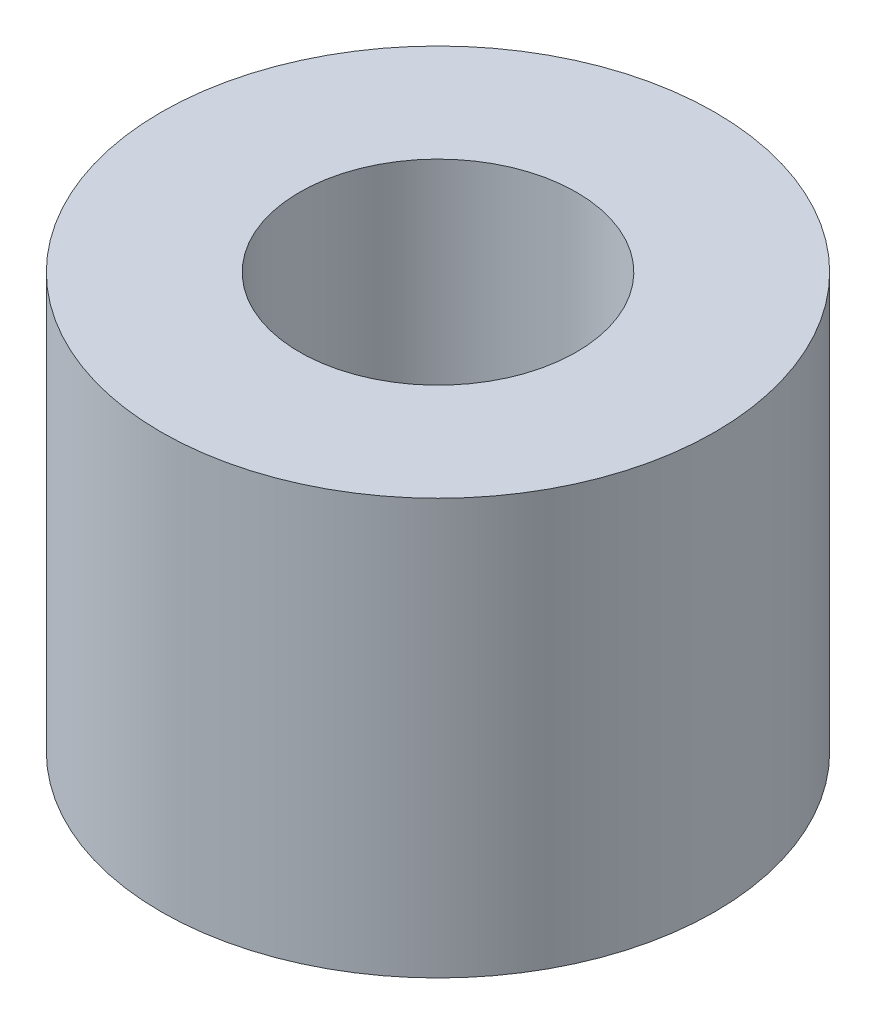
ISO-10303-21;
HEADER;
FILE_DESCRIPTION(('STEP AP214'),'2;1');
FILE_NAME('part.step','',(''),(''),'','','');
FILE_SCHEMA(('AUTOMOTIVE_DESIGN { 1 0 10303 214 1 1 1 1 }'));
ENDSEC;
DATA;
#1=APPLICATION_CONTEXT('core data for automotive mechanical design processes');
#2=APPLICATION_PROTOCOL_DEFINITION('international standard','automotive_design',2000,#1);
#3=PRODUCT_CONTEXT('',#1,'mechanical');
#4=PRODUCT('Part','Part','',(#3));
#5=PRODUCT_RELATED_PRODUCT_CATEGORY('part','',(#4));
#6=PRODUCT_DEFINITION_FORMATION('','',#4);
#7=PRODUCT_DEFINITION_CONTEXT('part definition',#1,'design');
#8=PRODUCT_DEFINITION('design','',#6,#7);
#9=PRODUCT_DEFINITION_SHAPE('','',#8);
#10=(LENGTH_UNIT() NAMED_UNIT(*) SI_UNIT(.MILLI.,.METRE.));
#11=(NAMED_UNIT(*) PLANE_ANGLE_UNIT() SI_UNIT($,.RADIAN.));
#12=(NAMED_UNIT(*) SI_UNIT($,.STERADIAN.) SOLID_ANGLE_UNIT());
#13=UNCERTAINTY_MEASURE_WITH_UNIT(LENGTH_MEASURE(1.E-05),#10,'distance_accuracy_value','');
#14=(GEOMETRIC_REPRESENTATION_CONTEXT(3) GLOBAL_UNCERTAINTY_ASSIGNED_CONTEXT((#13)) GLOBAL_UNIT_ASSIGNED_CONTEXT((#10,
#11,#12)) REPRESENTATION_CONTEXT('',''));
#15=CARTESIAN_POINT('',(0.,0.,0.));
#16=DIRECTION('',(0.,0.,1.));
#17=DIRECTION('',(1.,0.,0.));
#18=AXIS2_PLACEMENT_3D('',#15,#16,#17);
#19=CARTESIAN_POINT('',(0.,9.525,0.));
#20=DIRECTION('',(0.,1.,0.));
#21=DIRECTION('',(0.,0.,1.));
#22=AXIS2_PLACEMENT_3D('',#19,#20,#21);
#23=PLANE('',#22);
#24=CARTESIAN_POINT('',(0.,9.525,0.));
#25=DIRECTION('',(0.,1.,0.));
#26=DIRECTION('',(0.,0.,1.));
#27=AXIS2_PLACEMENT_3D('',#24,#25,#26);
#28=CIRCLE('',#27,6.35);
#29=CARTESIAN_POINT('',(0.,9.525,-6.35));
#30=VERTEX_POINT('',#29);
#31=EDGE_CURVE('E10',#30,#30,#28,.T.);
#32=ORIENTED_EDGE('',*,*,#31,.T.);
#33=EDGE_LOOP('',(#32));
#34=FACE_BOUND('',#33,.T.);
#35=CARTESIAN_POINT('',(0.,9.525,0.));
#36=DIRECTION('',(0.,1.,0.));
#37=DIRECTION('',(0.,0.,1.));
#38=AXIS2_PLACEMENT_3D('',#35,#36,#37);
#39=CIRCLE('',#38,3.175);
#40=CARTESIAN_POINT('',(0.,9.525,-3.175));
#41=VERTEX_POINT('',#40);
#42=EDGE_CURVE('E54',#41,#41,#39,.T.);
#43=ORIENTED_EDGE('',*,*,#42,.F.);
#44=EDGE_LOOP('',(#43));
#45=FACE_BOUND('',#44,.T.);
#46=ADVANCED_FACE('F41',(#34,#45),#23,.T.);
#47=CARTESIAN_POINT('',(0.,0.,0.));
#48=DIRECTION('',(0.,1.,0.));
#49=DIRECTION('',(0.,0.,1.));
#50=AXIS2_PLACEMENT_3D('',#47,#48,#49);
#51=PLANE('',#50);
#52=CARTESIAN_POINT('',(0.,0.,0.));
#53=DIRECTION('',(0.,1.,0.));
#54=DIRECTION('',(0.,0.,1.));
#55=AXIS2_PLACEMENT_3D('',#52,#53,#54);
#56=CIRCLE('',#55,6.35);
#57=CARTESIAN_POINT('',(0.,0.,-6.35));
#58=VERTEX_POINT('',#57);
#59=EDGE_CURVE('E45',#58,#58,#56,.T.);
#60=ORIENTED_EDGE('',*,*,#59,.F.);
#61=EDGE_LOOP('',(#60));
#62=FACE_BOUND('',#61,.T.);
#63=CARTESIAN_POINT('',(0.,0.,0.));
#64=DIRECTION('',(0.,1.,0.));
#65=DIRECTION('',(0.,0.,1.));
#66=AXIS2_PLACEMENT_3D('',#63,#64,#65);
#67=CIRCLE('',#66,3.175);
#68=CARTESIAN_POINT('',(0.,0.,-3.175));
#69=VERTEX_POINT('',#68);
#70=EDGE_CURVE('E56',#69,#69,#67,.T.);
#71=ORIENTED_EDGE('',*,*,#70,.T.);
#72=EDGE_LOOP('',(#71));
#73=FACE_BOUND('',#72,.T.);
#74=ADVANCED_FACE('F68',(#62,#73),#51,.F.);
#75=CARTESIAN_POINT('',(0.,9.525,0.));
#76=DIRECTION('',(0.,-1.,0.));
#77=DIRECTION('',(0.,0.,-1.));
#78=AXIS2_PLACEMENT_3D('',#75,#76,#77);
#79=CYLINDRICAL_SURFACE('',#78,6.35);
#80=CARTESIAN_POINT('',(0.,9.525,-6.35));
#81=CARTESIAN_POINT('',(0.,9.42578125,-6.35));
#82=CARTESIAN_POINT('',(0.,9.3265625,-6.35));
#83=CARTESIAN_POINT('',(0.,9.128125,-6.35));
#84=CARTESIAN_POINT('',(0.,9.02890625,-6.35));
#85=CARTESIAN_POINT('',(0.,8.83046875,-6.35));
#86=CARTESIAN_POINT('',(0.,8.73125,-6.35));
#87=CARTESIAN_POINT('',(0.,8.5328125,-6.35));
#88=CARTESIAN_POINT('',(0.,8.43359375,-6.35));
#89=CARTESIAN_POINT('',(0.,8.23515625,-6.35));
#90=CARTESIAN_POINT('',(0.,8.1359375,-6.35));
#91=CARTESIAN_POINT('',(0.,7.9375,-6.35));
#92=CARTESIAN_POINT('',(0.,7.83828125,-6.35));
#93=CARTESIAN_POINT('',(0.,7.63984375,-6.35));
#94=CARTESIAN_POINT('',(0.,7.540625,-6.35));
#95=CARTESIAN_POINT('',(0.,7.3421875,-6.35));
#96=CARTESIAN_POINT('',(0.,7.24296875,-6.35));
#97=CARTESIAN_POINT('',(0.,7.04453125,-6.35));
#98=CARTESIAN_POINT('',(0.,6.9453125,-6.35));
#99=CARTESIAN_POINT('',(0.,6.746875,-6.35));
#100=CARTESIAN_POINT('',(0.,6.64765625,-6.35));
#101=CARTESIAN_POINT('',(0.,6.44921875,-6.35));
#102=CARTESIAN_POINT('',(0.,6.35,-6.35));
#103=CARTESIAN_POINT('',(0.,6.1515625,-6.35));
#104=CARTESIAN_POINT('',(0.,6.05234375,-6.35));
#105=CARTESIAN_POINT('',(0.,5.85390625,-6.35));
#106=CARTESIAN_POINT('',(0.,5.7546875,-6.35));
#107=CARTESIAN_POINT('',(0.,5.55625,-6.35));
#108=CARTESIAN_POINT('',(0.,5.45703125,-6.35));
#109=CARTESIAN_POINT('',(0.,5.25859375,-6.35));
#110=CARTESIAN_POINT('',(0.,5.159375,-6.35));
#111=CARTESIAN_POINT('',(0.,4.9609375,-6.35));
#112=CARTESIAN_POINT('',(0.,4.86171875,-6.35));
#113=CARTESIAN_POINT('',(0.,4.66328125,-6.35));
#114=CARTESIAN_POINT('',(0.,4.5640625,-6.35));
#115=CARTESIAN_POINT('',(0.,4.365625,-6.35));
#116=CARTESIAN_POINT('',(0.,4.26640625,-6.35));
#117=CARTESIAN_POINT('',(0.,4.06796875,-6.35));
#118=CARTESIAN_POINT('',(0.,3.96875,-6.35));
#119=CARTESIAN_POINT('',(0.,3.7703125,-6.35));
#120=CARTESIAN_POINT('',(0.,3.67109375,-6.35));
#121=CARTESIAN_POINT('',(0.,3.47265625,-6.35));
#122=CARTESIAN_POINT('',(0.,3.3734375,-6.35));
#123=CARTESIAN_POINT('',(0.,3.175,-6.35));
#124=CARTESIAN_POINT('',(0.,3.07578125,-6.35));
#125=CARTESIAN_POINT('',(0.,2.87734375,-6.35));
#126=CARTESIAN_POINT('',(0.,2.778125,-6.35));
#127=CARTESIAN_POINT('',(0.,2.5796875,-6.35));
#128=CARTESIAN_POINT('',(0.,2.48046875,-6.35));
#129=CARTESIAN_POINT('',(0.,2.28203125,-6.35));
#130=CARTESIAN_POINT('',(0.,2.1828125,-6.35));
#131=CARTESIAN_POINT('',(0.,1.984375,-6.35));
#132=CARTESIAN_POINT('',(0.,1.88515625,-6.35));
#133=CARTESIAN_POINT('',(0.,1.68671875,-6.35));
#134=CARTESIAN_POINT('',(0.,1.5875,-6.35));
#135=CARTESIAN_POINT('',(0.,1.3890625,-6.35));
#136=CARTESIAN_POINT('',(0.,1.28984375,-6.35));
#137=CARTESIAN_POINT('',(0.,1.09140625,-6.35));
#138=CARTESIAN_POINT('',(0.,0.992187500000001,-6.35));
#139=CARTESIAN_POINT('',(0.,0.793750000000001,-6.35));
#140=CARTESIAN_POINT('',(0.,0.69453125,-6.35));
#141=CARTESIAN_POINT('',(0.,0.49609375,-6.35));
#142=CARTESIAN_POINT('',(0.,0.396875,-6.35));
#143=CARTESIAN_POINT('',(0.,0.1984375,-6.35));
#144=CARTESIAN_POINT('',(0.,0.0992187500000001,-6.35));
#145=CARTESIAN_POINT('',(0.,0.,-6.35));
#146=B_SPLINE_CURVE_WITH_KNOTS('',3,(#80,#81,#82,#83,#84,#85,#86,#87,#88,#89,#90,#91,#92,#93,
#94,#95,#96,#97,#98,#99,#100,#101,#102,#103,#104,#105,#106,#107,#108,#109,#110,#111,#112,#113,
#114,#115,#116,#117,#118,#119,#120,#121,#122,#123,#124,#125,#126,#127,#128,#129,#130,#131,#132,
#133,#134,#135,#136,#137,#138,#139,#140,#141,#142,#143,#144,#145),.UNSPECIFIED.,.F.,.F.,(4,2,2,
2,2,2,2,2,2,2,2,2,2,2,2,2,2,2,2,2,2,2,2,2,2,2,2,2,2,2,2,2,4),(0.,0.297656249999998,
0.595312499999999,0.892968749999999,1.190625,1.48828125,1.7859375,2.08359375,2.38125,2.67890625,
2.9765625,3.27421875,3.571875,3.86953125,4.1671875,4.46484375,4.7625,5.06015625,5.3578125,
5.65546875,5.953125,6.25078125,6.5484375,6.84609375,7.14375,7.44140625,7.7390625,8.03671875,
8.334375,8.63203125,8.9296875,9.22734375,9.525),.UNSPECIFIED.);
#147=EDGE_CURVE('BSEAM43',#30,#58,#146,.T.);
#148=ORIENTED_EDGE('',*,*,#31,.F.);
#149=ORIENTED_EDGE('',*,*,#59,.T.);
#150=ORIENTED_EDGE('',*,*,#147,.T.);
#151=ORIENTED_EDGE('',*,*,#147,.F.);
#152=EDGE_LOOP('',(#148,#150,#149,#151));
#153=FACE_BOUND('',#152,.T.);
#154=ADVANCED_FACE('F43',(#153),#79,.T.);
#155=CARTESIAN_POINT('',(0.,9.525,0.));
#156=DIRECTION('',(0.,-1.,0.));
#157=DIRECTION('',(0.,0.,-1.));
#158=AXIS2_PLACEMENT_3D('',#155,#156,#157);
#159=CYLINDRICAL_SURFACE('',#158,3.175);
#160=CARTESIAN_POINT('',(0.,9.525,-3.175));
#161=CARTESIAN_POINT('',(0.,9.42578125,-3.175));
#162=CARTESIAN_POINT('',(0.,9.3265625,-3.175));
#163=CARTESIAN_POINT('',(0.,9.128125,-3.175));
#164=CARTESIAN_POINT('',(0.,9.02890625,-3.175));
#165=CARTESIAN_POINT('',(0.,8.83046875,-3.175));
#166=CARTESIAN_POINT('',(0.,8.73125,-3.175));
#167=CARTESIAN_POINT('',(0.,8.5328125,-3.175));
#168=CARTESIAN_POINT('',(0.,8.43359375,-3.175));
#169=CARTESIAN_POINT('',(0.,8.23515625,-3.175));
#170=CARTESIAN_POINT('',(0.,8.1359375,-3.175));
#171=CARTESIAN_POINT('',(0.,7.9375,-3.175));
#172=CARTESIAN_POINT('',(0.,7.83828125,-3.175));
#173=CARTESIAN_POINT('',(0.,7.63984375,-3.175));
#174=CARTESIAN_POINT('',(0.,7.540625,-3.175));
#175=CARTESIAN_POINT('',(0.,7.3421875,-3.175));
#176=CARTESIAN_POINT('',(0.,7.24296875,-3.175));
#177=CARTESIAN_POINT('',(0.,7.04453125,-3.175));
#178=CARTESIAN_POINT('',(0.,6.9453125,-3.175));
#179=CARTESIAN_POINT('',(0.,6.746875,-3.175));
#180=CARTESIAN_POINT('',(0.,6.64765625,-3.175));
#181=CARTESIAN_POINT('',(0.,6.44921875,-3.175));
#182=CARTESIAN_POINT('',(0.,6.35,-3.175));
#183=CARTESIAN_POINT('',(0.,6.1515625,-3.175));
#184=CARTESIAN_POINT('',(0.,6.05234375,-3.175));
#185=CARTESIAN_POINT('',(0.,5.85390625,-3.175));
#186=CARTESIAN_POINT('',(0.,5.7546875,-3.175));
#187=CARTESIAN_POINT('',(0.,5.55625,-3.175));
#188=CARTESIAN_POINT('',(0.,5.45703125,-3.175));
#189=CARTESIAN_POINT('',(0.,5.25859375,-3.175));
#190=CARTESIAN_POINT('',(0.,5.159375,-3.175));
#191=CARTESIAN_POINT('',(0.,4.9609375,-3.175));
#192=CARTESIAN_POINT('',(0.,4.86171875,-3.175));
#193=CARTESIAN_POINT('',(0.,4.66328125,-3.175));
#194=CARTESIAN_POINT('',(0.,4.5640625,-3.175));
#195=CARTESIAN_POINT('',(0.,4.365625,-3.175));
#196=CARTESIAN_POINT('',(0.,4.26640625,-3.175));
#197=CARTESIAN_POINT('',(0.,4.06796875,-3.175));
#198=CARTESIAN_POINT('',(0.,3.96875,-3.175));
#199=CARTESIAN_POINT('',(0.,3.7703125,-3.175));
#200=CARTESIAN_POINT('',(0.,3.67109375,-3.175));
#201=CARTESIAN_POINT('',(0.,3.47265625,-3.175));
#202=CARTESIAN_POINT('',(0.,3.3734375,-3.175));
#203=CARTESIAN_POINT('',(0.,3.175,-3.175));
#204=CARTESIAN_POINT('',(0.,3.07578125,-3.175));
#205=CARTESIAN_POINT('',(0.,2.87734375,-3.175));
#206=CARTESIAN_POINT('',(0.,2.778125,-3.175));
#207=CARTESIAN_POINT('',(0.,2.5796875,-3.175));
#208=CARTESIAN_POINT('',(0.,2.48046875,-3.175));
#209=CARTESIAN_POINT('',(0.,2.28203125,-3.175));
#210=CARTESIAN_POINT('',(0.,2.1828125,-3.175));
#211=CARTESIAN_POINT('',(0.,1.984375,-3.175));
#212=CARTESIAN_POINT('',(0.,1.88515625,-3.175));
#213=CARTESIAN_POINT('',(0.,1.68671875,-3.175));
#214=CARTESIAN_POINT('',(0.,1.5875,-3.175));
#215=CARTESIAN_POINT('',(0.,1.3890625,-3.175));
#216=CARTESIAN_POINT('',(0.,1.28984375,-3.175));
#217=CARTESIAN_POINT('',(0.,1.09140625,-3.175));
#218=CARTESIAN_POINT('',(0.,0.992187500000001,-3.175));
#219=CARTESIAN_POINT('',(0.,0.793750000000001,-3.175));
#220=CARTESIAN_POINT('',(0.,0.69453125,-3.175));
#221=CARTESIAN_POINT('',(0.,0.49609375,-3.175));
#222=CARTESIAN_POINT('',(0.,0.396875,-3.175));
#223=CARTESIAN_POINT('',(0.,0.1984375,-3.175));
#224=CARTESIAN_POINT('',(0.,0.0992187500000001,-3.175));
#225=CARTESIAN_POINT('',(0.,0.,-3.175));
#226=B_SPLINE_CURVE_WITH_KNOTS('',3,(#160,#161,#162,#163,#164,#165,#166,#167,#168,#169,#170,
#171,#172,#173,#174,#175,#176,#177,#178,#179,#180,#181,#182,#183,#184,#185,#186,#187,#188,#189,
#190,#191,#192,#193,#194,#195,#196,#197,#198,#199,#200,#201,#202,#203,#204,#205,#206,#207,#208,
#209,#210,#211,#212,#213,#214,#215,#216,#217,#218,#219,#220,#221,#222,#223,#224,#225),
.UNSPECIFIED.,.F.,.F.,(4,2,2,2,2,2,2,2,2,2,2,2,2,2,2,2,2,2,2,2,2,2,2,2,2,2,2,2,2,2,2,2,4),(0.,
0.29765625,0.5953125,0.892968750000001,1.190625,1.48828125,1.7859375,2.08359375,2.38125,
2.67890625,2.9765625,3.27421875,3.571875,3.86953125,4.1671875,4.46484375,4.7625,5.06015625,
5.3578125,5.65546875,5.953125,6.25078125,6.5484375,6.84609375,7.14375,7.44140625,7.7390625,
8.03671875,8.334375,8.63203125,8.9296875,9.22734375,9.525),.UNSPECIFIED.);
#227=EDGE_CURVE('BSEAM64',#41,#69,#226,.T.);
#228=ORIENTED_EDGE('',*,*,#42,.T.);
#229=ORIENTED_EDGE('',*,*,#70,.F.);
#230=ORIENTED_EDGE('',*,*,#227,.T.);
#231=ORIENTED_EDGE('',*,*,#227,.F.);
#232=EDGE_LOOP('',(#228,#230,#229,#231));
#233=FACE_BOUND('',#232,.T.);
#234=ADVANCED_FACE('F64',(#233),#159,.F.);
#235=CLOSED_SHELL('',(#46,#74,#154,#234));
#236=MANIFOLD_SOLID_BREP('B2',#235);
#237=ADVANCED_BREP_SHAPE_REPRESENTATION('',(#18,#236),#14);
#238=SHAPE_DEFINITION_REPRESENTATION(#9,#237);
ENDSEC;
END-ISO-10303-21;
